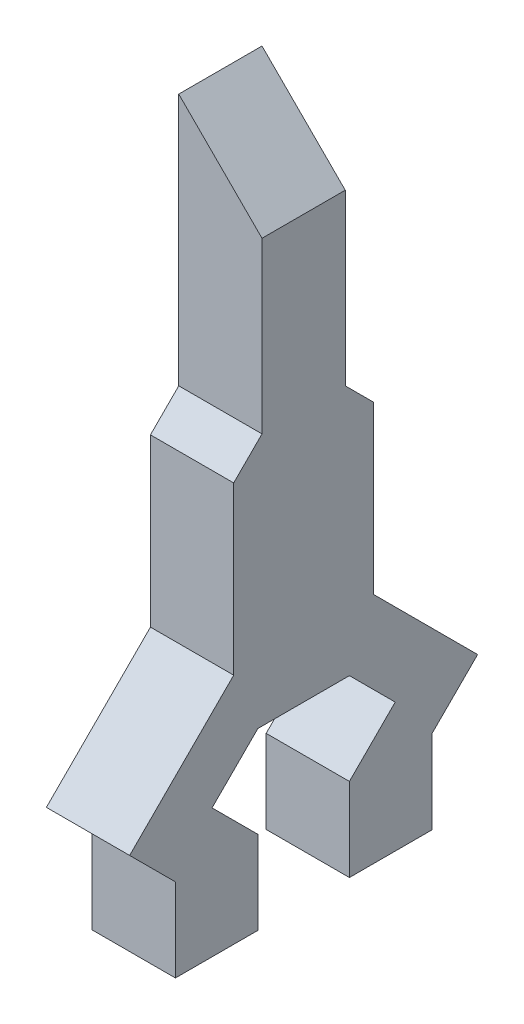
ISO-10303-21;
HEADER;
FILE_DESCRIPTION(('STEP AP214'),'2;1');
FILE_NAME('part.step','',(''),(''),'','','');
FILE_SCHEMA(('AUTOMOTIVE_DESIGN { 1 0 10303 214 1 1 1 1 }'));
ENDSEC;
DATA;
#1=APPLICATION_CONTEXT('core data for automotive mechanical design processes');
#2=APPLICATION_PROTOCOL_DEFINITION('international standard','automotive_design',2000,#1);
#3=PRODUCT_CONTEXT('',#1,'mechanical');
#4=PRODUCT('Part','Part','',(#3));
#5=PRODUCT_RELATED_PRODUCT_CATEGORY('part','',(#4));
#6=PRODUCT_DEFINITION_FORMATION('','',#4);
#7=PRODUCT_DEFINITION_CONTEXT('part definition',#1,'design');
#8=PRODUCT_DEFINITION('design','',#6,#7);
#9=PRODUCT_DEFINITION_SHAPE('','',#8);
#10=(LENGTH_UNIT() NAMED_UNIT(*) SI_UNIT(.MILLI.,.METRE.));
#11=(NAMED_UNIT(*) PLANE_ANGLE_UNIT() SI_UNIT($,.RADIAN.));
#12=(NAMED_UNIT(*) SI_UNIT($,.STERADIAN.) SOLID_ANGLE_UNIT());
#13=UNCERTAINTY_MEASURE_WITH_UNIT(LENGTH_MEASURE(1.E-05),#10,'distance_accuracy_value','');
#14=(GEOMETRIC_REPRESENTATION_CONTEXT(3) GLOBAL_UNCERTAINTY_ASSIGNED_CONTEXT((#13)) GLOBAL_UNIT_ASSIGNED_CONTEXT((#10,
#11,#12)) REPRESENTATION_CONTEXT('',''));
#15=CARTESIAN_POINT('',(0.,0.,0.));
#16=DIRECTION('',(0.,0.,1.));
#17=DIRECTION('',(1.,0.,0.));
#18=AXIS2_PLACEMENT_3D('',#15,#16,#17);
#19=CARTESIAN_POINT('',(10.,32.5,8.39949493661167));
#20=DIRECTION('',(0.,-0.707106781186539,-0.707106781186556));
#21=DIRECTION('',(0.,0.707106781186556,-0.707106781186539));
#22=AXIS2_PLACEMENT_3D('',#19,#20,#21);
#23=PLANE('',#22);
#24=DIRECTION('',(1.,0.,0.));
#25=VECTOR('',#24,1.);
#26=CARTESIAN_POINT('',(10.,35.8994949366118,5.));
#27=LINE('',#26,#25);
#28=CARTESIAN_POINT('',(0.,35.8994949366118,5.));
#29=VERTEX_POINT('',#28);
#30=CARTESIAN_POINT('',(10.,35.8994949366118,5.));
#31=VERTEX_POINT('',#30);
#32=EDGE_CURVE('E196',#29,#31,#27,.T.);
#33=ORIENTED_EDGE('',*,*,#32,.F.);
#34=DIRECTION('',(0.,-0.707106781186556,0.707106781186539));
#35=VECTOR('',#34,1.);
#36=CARTESIAN_POINT('',(0.,32.5,8.39949493661167));
#37=LINE('',#36,#35);
#38=CARTESIAN_POINT('',(0.,32.5,8.39949493661167));
#39=VERTEX_POINT('',#38);
#40=EDGE_CURVE('E315',#29,#39,#37,.T.);
#41=ORIENTED_EDGE('',*,*,#40,.T.);
#42=DIRECTION('',(-1.,0.,0.));
#43=VECTOR('',#42,1.);
#44=CARTESIAN_POINT('',(10.,32.5,8.39949493661167));
#45=LINE('',#44,#43);
#46=CARTESIAN_POINT('',(10.,32.5,8.39949493661167));
#47=VERTEX_POINT('',#46);
#48=EDGE_CURVE('E393',#47,#39,#45,.T.);
#49=ORIENTED_EDGE('',*,*,#48,.F.);
#50=DIRECTION('',(0.,-0.707106781186556,0.707106781186539));
#51=VECTOR('',#50,1.);
#52=CARTESIAN_POINT('',(10.,32.5,8.39949493661167));
#53=LINE('',#52,#51);
#54=EDGE_CURVE('E258',#31,#47,#53,.T.);
#55=ORIENTED_EDGE('',*,*,#54,.F.);
#56=EDGE_LOOP('',(#33,#41,#49,#55));
#57=FACE_BOUND('',#56,.T.);
#58=ADVANCED_FACE('F39',(#57),#23,.F.);
#59=CARTESIAN_POINT('',(10.,-5.5,-5.5));
#60=DIRECTION('',(0.,0.,-1.));
#61=DIRECTION('',(-1.,0.,0.));
#62=AXIS2_PLACEMENT_3D('',#59,#60,#61);
#63=PLANE('',#62);
#64=DIRECTION('',(0.,-1.,0.));
#65=VECTOR('',#64,1.);
#66=CARTESIAN_POINT('',(0.,-5.5,-5.5));
#67=LINE('',#66,#65);
#68=CARTESIAN_POINT('',(0.,-5.5,-5.5));
#69=VERTEX_POINT('',#68);
#70=CARTESIAN_POINT('',(0.,-15.5,-5.5));
#71=VERTEX_POINT('',#70);
#72=EDGE_CURVE('E234',#69,#71,#67,.T.);
#73=ORIENTED_EDGE('',*,*,#72,.T.);
#74=DIRECTION('',(-1.,0.,0.));
#75=VECTOR('',#74,1.);
#76=CARTESIAN_POINT('',(10.,-15.5,-5.5));
#77=LINE('',#76,#75);
#78=CARTESIAN_POINT('',(10.,-15.5,-5.5));
#79=VERTEX_POINT('',#78);
#80=EDGE_CURVE('E11',#79,#71,#77,.T.);
#81=ORIENTED_EDGE('',*,*,#80,.F.);
#82=DIRECTION('',(0.,-1.,0.));
#83=VECTOR('',#82,1.);
#84=CARTESIAN_POINT('',(10.,-5.5,-5.5));
#85=LINE('',#84,#83);
#86=CARTESIAN_POINT('',(10.,-5.5,-5.5));
#87=VERTEX_POINT('',#86);
#88=EDGE_CURVE('E235',#87,#79,#85,.T.);
#89=ORIENTED_EDGE('',*,*,#88,.F.);
#90=DIRECTION('',(-1.,0.,0.));
#91=VECTOR('',#90,1.);
#92=CARTESIAN_POINT('',(10.,-5.5,-5.5));
#93=LINE('',#92,#91);
#94=EDGE_CURVE('E294',#87,#69,#93,.T.);
#95=ORIENTED_EDGE('',*,*,#94,.T.);
#96=EDGE_LOOP('',(#73,#81,#89,#95));
#97=FACE_BOUND('',#96,.T.);
#98=ADVANCED_FACE('F41',(#97),#63,.F.);
#99=CARTESIAN_POINT('',(10.,-15.5,-15.3994949366117));
#100=DIRECTION('',(0.,1.,0.));
#101=DIRECTION('',(0.,0.,1.));
#102=AXIS2_PLACEMENT_3D('',#99,#100,#101);
#103=PLANE('',#102);
#104=DIRECTION('',(0.,0.,-1.));
#105=VECTOR('',#104,1.);
#106=CARTESIAN_POINT('',(0.,-15.5,-15.3994949366117));
#107=LINE('',#106,#105);
#108=CARTESIAN_POINT('',(0.,-15.5,-15.3994949366117));
#109=VERTEX_POINT('',#108);
#110=EDGE_CURVE('E298',#71,#109,#107,.T.);
#111=ORIENTED_EDGE('',*,*,#110,.T.);
#112=DIRECTION('',(-1.,0.,0.));
#113=VECTOR('',#112,1.);
#114=CARTESIAN_POINT('',(10.,-15.5,-15.3994949366117));
#115=LINE('',#114,#113);
#116=CARTESIAN_POINT('',(10.,-15.5,-15.3994949366117));
#117=VERTEX_POINT('',#116);
#118=EDGE_CURVE('E48',#117,#109,#115,.T.);
#119=ORIENTED_EDGE('',*,*,#118,.F.);
#120=DIRECTION('',(0.,0.,-1.));
#121=VECTOR('',#120,1.);
#122=CARTESIAN_POINT('',(10.,-15.5,-15.3994949366117));
#123=LINE('',#122,#121);
#124=EDGE_CURVE('E239',#79,#117,#123,.T.);
#125=ORIENTED_EDGE('',*,*,#124,.F.);
#126=ORIENTED_EDGE('',*,*,#80,.T.);
#127=EDGE_LOOP('',(#111,#119,#125,#126));
#128=FACE_BOUND('',#127,.T.);
#129=ADVANCED_FACE('F439',(#128),#103,.F.);
#130=CARTESIAN_POINT('',(10.,-5.5,-15.3994949366117));
#131=DIRECTION('',(0.,0.,1.));
#132=DIRECTION('',(1.,0.,0.));
#133=AXIS2_PLACEMENT_3D('',#130,#131,#132);
#134=PLANE('',#133);
#135=DIRECTION('',(0.,1.,0.));
#136=VECTOR('',#135,1.);
#137=CARTESIAN_POINT('',(0.,-5.5,-15.3994949366117));
#138=LINE('',#137,#136);
#139=CARTESIAN_POINT('',(0.,-5.5,-15.3994949366117));
#140=VERTEX_POINT('',#139);
#141=EDGE_CURVE('E301',#109,#140,#138,.T.);
#142=ORIENTED_EDGE('',*,*,#141,.T.);
#143=DIRECTION('',(-1.,0.,0.));
#144=VECTOR('',#143,1.);
#145=CARTESIAN_POINT('',(10.,-5.5,-15.3994949366117));
#146=LINE('',#145,#144);
#147=CARTESIAN_POINT('',(10.,-5.5,-15.3994949366117));
#148=VERTEX_POINT('',#147);
#149=EDGE_CURVE('E408',#148,#140,#146,.T.);
#150=ORIENTED_EDGE('',*,*,#149,.F.);
#151=DIRECTION('',(0.,1.,0.));
#152=VECTOR('',#151,1.);
#153=CARTESIAN_POINT('',(10.,-5.5,-15.3994949366117));
#154=LINE('',#153,#152);
#155=EDGE_CURVE('E243',#117,#148,#154,.T.);
#156=ORIENTED_EDGE('',*,*,#155,.F.);
#157=ORIENTED_EDGE('',*,*,#118,.T.);
#158=EDGE_LOOP('',(#142,#150,#156,#157));
#159=FACE_BOUND('',#158,.T.);
#160=ADVANCED_FACE('F417',(#159),#134,.F.);
#161=CARTESIAN_POINT('',(10.,0.,-20.8994949366117));
#162=DIRECTION('',(0.,0.707106781186547,0.707106781186548));
#163=DIRECTION('',(0.,-0.707106781186548,0.707106781186547));
#164=AXIS2_PLACEMENT_3D('',#161,#162,#163);
#165=PLANE('',#164);
#166=DIRECTION('',(0.,0.707106781186548,-0.707106781186547));
#167=VECTOR('',#166,1.);
#168=CARTESIAN_POINT('',(0.,0.,-20.8994949366117));
#169=LINE('',#168,#167);
#170=CARTESIAN_POINT('',(0.,0.,-20.8994949366117));
#171=VERTEX_POINT('',#170);
#172=EDGE_CURVE('E304',#140,#171,#169,.T.);
#173=ORIENTED_EDGE('',*,*,#172,.T.);
#174=DIRECTION('',(-1.,0.,0.));
#175=VECTOR('',#174,1.);
#176=CARTESIAN_POINT('',(10.,0.,-20.8994949366117));
#177=LINE('',#176,#175);
#178=CARTESIAN_POINT('',(10.,0.,-20.8994949366117));
#179=VERTEX_POINT('',#178);
#180=EDGE_CURVE('E404',#179,#171,#177,.T.);
#181=ORIENTED_EDGE('',*,*,#180,.F.);
#182=DIRECTION('',(0.,0.707106781186548,-0.707106781186547));
#183=VECTOR('',#182,1.);
#184=CARTESIAN_POINT('',(10.,0.,-20.8994949366117));
#185=LINE('',#184,#183);
#186=EDGE_CURVE('E246',#148,#179,#185,.T.);
#187=ORIENTED_EDGE('',*,*,#186,.F.);
#188=ORIENTED_EDGE('',*,*,#149,.T.);
#189=EDGE_LOOP('',(#173,#181,#187,#188));
#190=FACE_BOUND('',#189,.T.);
#191=ADVANCED_FACE('F429',(#190),#165,.F.);
#192=CARTESIAN_POINT('',(10.,12.5,-8.39949493661167));
#193=DIRECTION('',(0.,-0.707106781186547,0.707106781186548));
#194=DIRECTION('',(0.,-0.707106781186548,-0.707106781186547));
#195=AXIS2_PLACEMENT_3D('',#192,#193,#194);
#196=PLANE('',#195);
#197=DIRECTION('',(0.,0.707106781186548,0.707106781186547));
#198=VECTOR('',#197,1.);
#199=CARTESIAN_POINT('',(0.,12.5,-8.39949493661167));
#200=LINE('',#199,#198);
#201=CARTESIAN_POINT('',(0.,12.5,-8.39949493661167));
#202=VERTEX_POINT('',#201);
#203=EDGE_CURVE('E307',#171,#202,#200,.T.);
#204=ORIENTED_EDGE('',*,*,#203,.T.);
#205=DIRECTION('',(-1.,0.,0.));
#206=VECTOR('',#205,1.);
#207=CARTESIAN_POINT('',(10.,12.5,-8.39949493661167));
#208=LINE('',#207,#206);
#209=CARTESIAN_POINT('',(10.,12.5,-8.39949493661167));
#210=VERTEX_POINT('',#209);
#211=EDGE_CURVE('E400',#210,#202,#208,.T.);
#212=ORIENTED_EDGE('',*,*,#211,.F.);
#213=DIRECTION('',(0.,0.707106781186548,0.707106781186547));
#214=VECTOR('',#213,1.);
#215=CARTESIAN_POINT('',(10.,12.5,-8.39949493661167));
#216=LINE('',#215,#214);
#217=EDGE_CURVE('E249',#179,#210,#216,.T.);
#218=ORIENTED_EDGE('',*,*,#217,.F.);
#219=ORIENTED_EDGE('',*,*,#180,.T.);
#220=EDGE_LOOP('',(#204,#212,#218,#219));
#221=FACE_BOUND('',#220,.T.);
#222=ADVANCED_FACE('F433',(#221),#196,.F.);
#223=CARTESIAN_POINT('',(10.,32.5000000000004,-8.39949493661167));
#224=DIRECTION('',(0.,0.,1.));
#225=DIRECTION('',(1.,0.,0.));
#226=AXIS2_PLACEMENT_3D('',#223,#224,#225);
#227=PLANE('',#226);
#228=DIRECTION('',(0.,1.,0.));
#229=VECTOR('',#228,1.);
#230=CARTESIAN_POINT('',(0.,32.5000000000004,-8.39949493661167));
#231=LINE('',#230,#229);
#232=CARTESIAN_POINT('',(0.,32.5000000000004,-8.39949493661167));
#233=VERTEX_POINT('',#232);
#234=EDGE_CURVE('E310',#202,#233,#231,.T.);
#235=ORIENTED_EDGE('',*,*,#234,.T.);
#236=DIRECTION('',(-1.,0.,0.));
#237=VECTOR('',#236,1.);
#238=CARTESIAN_POINT('',(10.,32.5000000000004,-8.39949493661167));
#239=LINE('',#238,#237);
#240=CARTESIAN_POINT('',(10.,32.5000000000004,-8.39949493661167));
#241=VERTEX_POINT('',#240);
#242=EDGE_CURVE('E397',#241,#233,#239,.T.);
#243=ORIENTED_EDGE('',*,*,#242,.F.);
#244=DIRECTION('',(0.,1.,0.));
#245=VECTOR('',#244,1.);
#246=CARTESIAN_POINT('',(10.,32.5000000000004,-8.39949493661167));
#247=LINE('',#246,#245);
#248=EDGE_CURVE('E252',#210,#241,#247,.T.);
#249=ORIENTED_EDGE('',*,*,#248,.F.);
#250=ORIENTED_EDGE('',*,*,#211,.T.);
#251=EDGE_LOOP('',(#235,#243,#249,#250));
#252=FACE_BOUND('',#251,.T.);
#253=ADVANCED_FACE('F520',(#252),#227,.F.);
#254=CARTESIAN_POINT('',(10.,40.8994949366119,0.));
#255=DIRECTION('',(0.,-0.707106781186557,0.707106781186538));
#256=DIRECTION('',(0.,-0.707106781186538,-0.707106781186557));
#257=AXIS2_PLACEMENT_3D('',#254,#255,#256);
#258=PLANE('',#257);
#259=DIRECTION('',(0.,0.707106781186538,0.707106781186557));
#260=VECTOR('',#259,1.);
#261=CARTESIAN_POINT('',(0.,40.8994949366119,0.));
#262=LINE('',#261,#260);
#263=CARTESIAN_POINT('',(0.,35.899494936612,-5.));
#264=VERTEX_POINT('',#263);
#265=EDGE_CURVE('E60',#233,#264,#262,.T.);
#266=ORIENTED_EDGE('',*,*,#265,.T.);
#267=DIRECTION('',(1.,0.,0.));
#268=VECTOR('',#267,1.);
#269=CARTESIAN_POINT('',(10.,35.899494936612,-5.));
#270=LINE('',#269,#268);
#271=CARTESIAN_POINT('',(10.,35.899494936612,-5.));
#272=VERTEX_POINT('',#271);
#273=EDGE_CURVE('E55',#264,#272,#270,.T.);
#274=ORIENTED_EDGE('',*,*,#273,.T.);
#275=DIRECTION('',(0.,0.707106781186538,0.707106781186557));
#276=VECTOR('',#275,1.);
#277=CARTESIAN_POINT('',(10.,40.8994949366119,0.));
#278=LINE('',#277,#276);
#279=EDGE_CURVE('E255',#241,#272,#278,.T.);
#280=ORIENTED_EDGE('',*,*,#279,.F.);
#281=ORIENTED_EDGE('',*,*,#242,.T.);
#282=EDGE_LOOP('',(#266,#274,#280,#281));
#283=FACE_BOUND('',#282,.T.);
#284=ADVANCED_FACE('F517',(#283),#258,.F.);
#285=CARTESIAN_POINT('',(10.,12.5,8.39949493661167));
#286=DIRECTION('',(0.,0.,-1.));
#287=DIRECTION('',(-1.,0.,0.));
#288=AXIS2_PLACEMENT_3D('',#285,#286,#287);
#289=PLANE('',#288);
#290=DIRECTION('',(0.,-1.,0.));
#291=VECTOR('',#290,1.);
#292=CARTESIAN_POINT('',(0.,12.5,8.39949493661167));
#293=LINE('',#292,#291);
#294=CARTESIAN_POINT('',(0.,12.5,8.39949493661167));
#295=VERTEX_POINT('',#294);
#296=EDGE_CURVE('E318',#39,#295,#293,.T.);
#297=ORIENTED_EDGE('',*,*,#296,.T.);
#298=DIRECTION('',(-1.,0.,0.));
#299=VECTOR('',#298,1.);
#300=CARTESIAN_POINT('',(10.,12.5,8.39949493661167));
#301=LINE('',#300,#299);
#302=CARTESIAN_POINT('',(10.,12.5,8.39949493661167));
#303=VERTEX_POINT('',#302);
#304=EDGE_CURVE('E389',#303,#295,#301,.T.);
#305=ORIENTED_EDGE('',*,*,#304,.F.);
#306=DIRECTION('',(0.,-1.,0.));
#307=VECTOR('',#306,1.);
#308=CARTESIAN_POINT('',(10.,12.5,8.39949493661167));
#309=LINE('',#308,#307);
#310=EDGE_CURVE('E261',#47,#303,#309,.T.);
#311=ORIENTED_EDGE('',*,*,#310,.F.);
#312=ORIENTED_EDGE('',*,*,#48,.T.);
#313=EDGE_LOOP('',(#297,#305,#311,#312));
#314=FACE_BOUND('',#313,.T.);
#315=ADVANCED_FACE('F495',(#314),#289,.F.);
#316=CARTESIAN_POINT('',(10.,12.5,8.39949493661167));
#317=DIRECTION('',(0.,-0.707106781186548,-0.707106781186548));
#318=DIRECTION('',(0.,0.707106781186548,-0.707106781186548));
#319=AXIS2_PLACEMENT_3D('',#316,#317,#318);
#320=PLANE('',#319);
#321=DIRECTION('',(0.,-0.707106781186547,0.707106781186547));
#322=VECTOR('',#321,1.);
#323=CARTESIAN_POINT('',(0.,12.5,8.39949493661167));
#324=LINE('',#323,#322);
#325=CARTESIAN_POINT('',(0.,0.,20.8994949366117));
#326=VERTEX_POINT('',#325);
#327=EDGE_CURVE('E321',#295,#326,#324,.T.);
#328=ORIENTED_EDGE('',*,*,#327,.T.);
#329=DIRECTION('',(-1.,0.,0.));
#330=VECTOR('',#329,1.);
#331=CARTESIAN_POINT('',(10.,0.,20.8994949366117));
#332=LINE('',#331,#330);
#333=CARTESIAN_POINT('',(10.,0.,20.8994949366117));
#334=VERTEX_POINT('',#333);
#335=EDGE_CURVE('E385',#334,#326,#332,.T.);
#336=ORIENTED_EDGE('',*,*,#335,.F.);
#337=DIRECTION('',(0.,-0.707106781186547,0.707106781186547));
#338=VECTOR('',#337,1.);
#339=CARTESIAN_POINT('',(10.,12.5,8.39949493661167));
#340=LINE('',#339,#338);
#341=EDGE_CURVE('E264',#303,#334,#340,.T.);
#342=ORIENTED_EDGE('',*,*,#341,.F.);
#343=ORIENTED_EDGE('',*,*,#304,.T.);
#344=EDGE_LOOP('',(#328,#336,#342,#343));
#345=FACE_BOUND('',#344,.T.);
#346=ADVANCED_FACE('F490',(#345),#320,.F.);
#347=CARTESIAN_POINT('',(10.,0.,20.8994949366117));
#348=DIRECTION('',(0.,0.707106781186547,-0.707106781186548));
#349=DIRECTION('',(0.,0.707106781186548,0.707106781186547));
#350=AXIS2_PLACEMENT_3D('',#347,#348,#349);
#351=PLANE('',#350);
#352=DIRECTION('',(0.,-0.707106781186548,-0.707106781186547));
#353=VECTOR('',#352,1.);
#354=CARTESIAN_POINT('',(0.,0.,20.8994949366117));
#355=LINE('',#354,#353);
#356=CARTESIAN_POINT('',(0.,-5.5,15.3994949366117));
#357=VERTEX_POINT('',#356);
#358=EDGE_CURVE('E324',#326,#357,#355,.T.);
#359=ORIENTED_EDGE('',*,*,#358,.T.);
#360=DIRECTION('',(-1.,0.,0.));
#361=VECTOR('',#360,1.);
#362=CARTESIAN_POINT('',(10.,-5.5,15.3994949366117));
#363=LINE('',#362,#361);
#364=CARTESIAN_POINT('',(10.,-5.5,15.3994949366117));
#365=VERTEX_POINT('',#364);
#366=EDGE_CURVE('E381',#365,#357,#363,.T.);
#367=ORIENTED_EDGE('',*,*,#366,.F.);
#368=DIRECTION('',(0.,-0.707106781186548,-0.707106781186547));
#369=VECTOR('',#368,1.);
#370=CARTESIAN_POINT('',(10.,0.,20.8994949366117));
#371=LINE('',#370,#369);
#372=EDGE_CURVE('E267',#334,#365,#371,.T.);
#373=ORIENTED_EDGE('',*,*,#372,.F.);
#374=ORIENTED_EDGE('',*,*,#335,.T.);
#375=EDGE_LOOP('',(#359,#367,#373,#374));
#376=FACE_BOUND('',#375,.T.);
#377=ADVANCED_FACE('F485',(#376),#351,.F.);
#378=CARTESIAN_POINT('',(10.,-15.5,15.3994949366117));
#379=DIRECTION('',(0.,0.,-1.));
#380=DIRECTION('',(-1.,0.,0.));
#381=AXIS2_PLACEMENT_3D('',#378,#379,#380);
#382=PLANE('',#381);
#383=DIRECTION('',(0.,-1.,0.));
#384=VECTOR('',#383,1.);
#385=CARTESIAN_POINT('',(0.,-15.5,15.3994949366117));
#386=LINE('',#385,#384);
#387=CARTESIAN_POINT('',(0.,-15.5,15.3994949366117));
#388=VERTEX_POINT('',#387);
#389=EDGE_CURVE('E327',#357,#388,#386,.T.);
#390=ORIENTED_EDGE('',*,*,#389,.T.);
#391=DIRECTION('',(-1.,0.,0.));
#392=VECTOR('',#391,1.);
#393=CARTESIAN_POINT('',(10.,-15.5,15.3994949366117));
#394=LINE('',#393,#392);
#395=CARTESIAN_POINT('',(10.,-15.5,15.3994949366117));
#396=VERTEX_POINT('',#395);
#397=EDGE_CURVE('E377',#396,#388,#394,.T.);
#398=ORIENTED_EDGE('',*,*,#397,.F.);
#399=DIRECTION('',(0.,-1.,0.));
#400=VECTOR('',#399,1.);
#401=CARTESIAN_POINT('',(10.,-15.5,15.3994949366117));
#402=LINE('',#401,#400);
#403=EDGE_CURVE('E270',#365,#396,#402,.T.);
#404=ORIENTED_EDGE('',*,*,#403,.F.);
#405=ORIENTED_EDGE('',*,*,#366,.T.);
#406=EDGE_LOOP('',(#390,#398,#404,#405));
#407=FACE_BOUND('',#406,.T.);
#408=ADVANCED_FACE('F481',(#407),#382,.F.);
#409=CARTESIAN_POINT('',(10.,-15.5,5.5));
#410=DIRECTION('',(0.,1.,0.));
#411=DIRECTION('',(0.,0.,1.));
#412=AXIS2_PLACEMENT_3D('',#409,#410,#411);
#413=PLANE('',#412);
#414=DIRECTION('',(0.,0.,-1.));
#415=VECTOR('',#414,1.);
#416=CARTESIAN_POINT('',(0.,-15.5,5.5));
#417=LINE('',#416,#415);
#418=CARTESIAN_POINT('',(0.,-15.5,5.5));
#419=VERTEX_POINT('',#418);
#420=EDGE_CURVE('E330',#388,#419,#417,.T.);
#421=ORIENTED_EDGE('',*,*,#420,.T.);
#422=DIRECTION('',(-1.,0.,0.));
#423=VECTOR('',#422,1.);
#424=CARTESIAN_POINT('',(10.,-15.5,5.5));
#425=LINE('',#424,#423);
#426=CARTESIAN_POINT('',(10.,-15.5,5.5));
#427=VERTEX_POINT('',#426);
#428=EDGE_CURVE('E373',#427,#419,#425,.T.);
#429=ORIENTED_EDGE('',*,*,#428,.F.);
#430=DIRECTION('',(0.,0.,-1.));
#431=VECTOR('',#430,1.);
#432=CARTESIAN_POINT('',(10.,-15.5,5.5));
#433=LINE('',#432,#431);
#434=EDGE_CURVE('E273',#396,#427,#433,.T.);
#435=ORIENTED_EDGE('',*,*,#434,.F.);
#436=ORIENTED_EDGE('',*,*,#397,.T.);
#437=EDGE_LOOP('',(#421,#429,#435,#436));
#438=FACE_BOUND('',#437,.T.);
#439=ADVANCED_FACE('F476',(#438),#413,.F.);
#440=CARTESIAN_POINT('',(10.,-5.5,5.5));
#441=DIRECTION('',(0.,0.,1.));
#442=DIRECTION('',(1.,0.,0.));
#443=AXIS2_PLACEMENT_3D('',#440,#441,#442);
#444=PLANE('',#443);
#445=DIRECTION('',(0.,1.,0.));
#446=VECTOR('',#445,1.);
#447=CARTESIAN_POINT('',(0.,-5.5,5.5));
#448=LINE('',#447,#446);
#449=CARTESIAN_POINT('',(0.,-5.5,5.5));
#450=VERTEX_POINT('',#449);
#451=EDGE_CURVE('E333',#419,#450,#448,.T.);
#452=ORIENTED_EDGE('',*,*,#451,.T.);
#453=DIRECTION('',(-1.,0.,0.));
#454=VECTOR('',#453,1.);
#455=CARTESIAN_POINT('',(10.,-5.5,5.5));
#456=LINE('',#455,#454);
#457=CARTESIAN_POINT('',(10.,-5.5,5.5));
#458=VERTEX_POINT('',#457);
#459=EDGE_CURVE('E369',#458,#450,#456,.T.);
#460=ORIENTED_EDGE('',*,*,#459,.F.);
#461=DIRECTION('',(0.,1.,0.));
#462=VECTOR('',#461,1.);
#463=CARTESIAN_POINT('',(10.,-5.5,5.5));
#464=LINE('',#463,#462);
#465=EDGE_CURVE('E276',#427,#458,#464,.T.);
#466=ORIENTED_EDGE('',*,*,#465,.F.);
#467=ORIENTED_EDGE('',*,*,#428,.T.);
#468=EDGE_LOOP('',(#452,#460,#466,#467));
#469=FACE_BOUND('',#468,.T.);
#470=ADVANCED_FACE('F470',(#469),#444,.F.);
#471=CARTESIAN_POINT('',(10.,0.,11.));
#472=DIRECTION('',(0.,-0.707106781186548,0.707106781186547));
#473=DIRECTION('',(0.,-0.707106781186547,-0.707106781186548));
#474=AXIS2_PLACEMENT_3D('',#471,#472,#473);
#475=PLANE('',#474);
#476=DIRECTION('',(0.,0.707106781186547,0.707106781186548));
#477=VECTOR('',#476,1.);
#478=CARTESIAN_POINT('',(0.,0.,11.));
#479=LINE('',#478,#477);
#480=CARTESIAN_POINT('',(0.,0.,11.));
#481=VERTEX_POINT('',#480);
#482=EDGE_CURVE('E336',#450,#481,#479,.T.);
#483=ORIENTED_EDGE('',*,*,#482,.T.);
#484=DIRECTION('',(-1.,0.,0.));
#485=VECTOR('',#484,1.);
#486=CARTESIAN_POINT('',(10.,0.,11.));
#487=LINE('',#486,#485);
#488=CARTESIAN_POINT('',(10.,0.,11.));
#489=VERTEX_POINT('',#488);
#490=EDGE_CURVE('E365',#489,#481,#487,.T.);
#491=ORIENTED_EDGE('',*,*,#490,.F.);
#492=DIRECTION('',(0.,0.707106781186547,0.707106781186548));
#493=VECTOR('',#492,1.);
#494=CARTESIAN_POINT('',(10.,0.,11.));
#495=LINE('',#494,#493);
#496=EDGE_CURVE('E279',#458,#489,#495,.T.);
#497=ORIENTED_EDGE('',*,*,#496,.F.);
#498=ORIENTED_EDGE('',*,*,#459,.T.);
#499=EDGE_LOOP('',(#483,#491,#497,#498));
#500=FACE_BOUND('',#499,.T.);
#501=ADVANCED_FACE('F466',(#500),#475,.F.);
#502=CARTESIAN_POINT('',(10.,5.5,5.5));
#503=DIRECTION('',(0.,0.707106781186548,0.707106781186548));
#504=DIRECTION('',(0.,-0.707106781186548,0.707106781186548));
#505=AXIS2_PLACEMENT_3D('',#502,#503,#504);
#506=PLANE('',#505);
#507=DIRECTION('',(0.,0.707106781186548,-0.707106781186548));
#508=VECTOR('',#507,1.);
#509=CARTESIAN_POINT('',(0.,5.5,5.5));
#510=LINE('',#509,#508);
#511=CARTESIAN_POINT('',(0.,5.5,5.5));
#512=VERTEX_POINT('',#511);
#513=EDGE_CURVE('E339',#481,#512,#510,.T.);
#514=ORIENTED_EDGE('',*,*,#513,.T.);
#515=DIRECTION('',(-1.,0.,0.));
#516=VECTOR('',#515,1.);
#517=CARTESIAN_POINT('',(10.,5.5,5.5));
#518=LINE('',#517,#516);
#519=CARTESIAN_POINT('',(10.,5.5,5.5));
#520=VERTEX_POINT('',#519);
#521=EDGE_CURVE('E361',#520,#512,#518,.T.);
#522=ORIENTED_EDGE('',*,*,#521,.F.);
#523=DIRECTION('',(0.,0.707106781186548,-0.707106781186548));
#524=VECTOR('',#523,1.);
#525=CARTESIAN_POINT('',(10.,5.5,5.5));
#526=LINE('',#525,#524);
#527=EDGE_CURVE('E282',#489,#520,#526,.T.);
#528=ORIENTED_EDGE('',*,*,#527,.F.);
#529=ORIENTED_EDGE('',*,*,#490,.T.);
#530=EDGE_LOOP('',(#514,#522,#528,#529));
#531=FACE_BOUND('',#530,.T.);
#532=ADVANCED_FACE('F461',(#531),#506,.F.);
#533=CARTESIAN_POINT('',(10.,5.5,5.5));
#534=DIRECTION('',(0.,1.,0.));
#535=DIRECTION('',(0.,0.,1.));
#536=AXIS2_PLACEMENT_3D('',#533,#534,#535);
#537=PLANE('',#536);
#538=DIRECTION('',(0.,0.,-1.));
#539=VECTOR('',#538,1.);
#540=CARTESIAN_POINT('',(0.,5.5,5.5));
#541=LINE('',#540,#539);
#542=CARTESIAN_POINT('',(0.,5.5,-5.5));
#543=VERTEX_POINT('',#542);
#544=EDGE_CURVE('E342',#512,#543,#541,.T.);
#545=ORIENTED_EDGE('',*,*,#544,.T.);
#546=DIRECTION('',(-1.,0.,0.));
#547=VECTOR('',#546,1.);
#548=CARTESIAN_POINT('',(10.,5.5,-5.5));
#549=LINE('',#548,#547);
#550=CARTESIAN_POINT('',(10.,5.5,-5.5));
#551=VERTEX_POINT('',#550);
#552=EDGE_CURVE('E357',#551,#543,#549,.T.);
#553=ORIENTED_EDGE('',*,*,#552,.F.);
#554=DIRECTION('',(0.,0.,-1.));
#555=VECTOR('',#554,1.);
#556=CARTESIAN_POINT('',(10.,5.5,5.5));
#557=LINE('',#556,#555);
#558=EDGE_CURVE('E285',#520,#551,#557,.T.);
#559=ORIENTED_EDGE('',*,*,#558,.F.);
#560=ORIENTED_EDGE('',*,*,#521,.T.);
#561=EDGE_LOOP('',(#545,#553,#559,#560));
#562=FACE_BOUND('',#561,.T.);
#563=ADVANCED_FACE('F455',(#562),#537,.F.);
#564=CARTESIAN_POINT('',(10.,5.5,-5.5));
#565=DIRECTION('',(0.,0.707106781186548,-0.707106781186547));
#566=DIRECTION('',(0.,0.707106781186547,0.707106781186548));
#567=AXIS2_PLACEMENT_3D('',#564,#565,#566);
#568=PLANE('',#567);
#569=DIRECTION('',(0.,-0.707106781186547,-0.707106781186548));
#570=VECTOR('',#569,1.);
#571=CARTESIAN_POINT('',(0.,5.5,-5.5));
#572=LINE('',#571,#570);
#573=CARTESIAN_POINT('',(0.,0.,-11.));
#574=VERTEX_POINT('',#573);
#575=EDGE_CURVE('E345',#543,#574,#572,.T.);
#576=ORIENTED_EDGE('',*,*,#575,.T.);
#577=DIRECTION('',(-1.,0.,0.));
#578=VECTOR('',#577,1.);
#579=CARTESIAN_POINT('',(10.,0.,-11.));
#580=LINE('',#579,#578);
#581=CARTESIAN_POINT('',(10.,0.,-11.));
#582=VERTEX_POINT('',#581);
#583=EDGE_CURVE('E353',#582,#574,#580,.T.);
#584=ORIENTED_EDGE('',*,*,#583,.F.);
#585=DIRECTION('',(0.,-0.707106781186547,-0.707106781186548));
#586=VECTOR('',#585,1.);
#587=CARTESIAN_POINT('',(10.,5.5,-5.5));
#588=LINE('',#587,#586);
#589=EDGE_CURVE('E288',#551,#582,#588,.T.);
#590=ORIENTED_EDGE('',*,*,#589,.F.);
#591=ORIENTED_EDGE('',*,*,#552,.T.);
#592=EDGE_LOOP('',(#576,#584,#590,#591));
#593=FACE_BOUND('',#592,.T.);
#594=ADVANCED_FACE('F451',(#593),#568,.F.);
#595=CARTESIAN_POINT('',(10.,0.,-11.));
#596=DIRECTION('',(0.,-0.707106781186547,-0.707106781186548));
#597=DIRECTION('',(0.,0.707106781186548,-0.707106781186547));
#598=AXIS2_PLACEMENT_3D('',#595,#596,#597);
#599=PLANE('',#598);
#600=DIRECTION('',(0.,-0.707106781186548,0.707106781186547));
#601=VECTOR('',#600,1.);
#602=CARTESIAN_POINT('',(0.,0.,-11.));
#603=LINE('',#602,#601);
#604=EDGE_CURVE('E240',#574,#69,#603,.T.);
#605=ORIENTED_EDGE('',*,*,#604,.T.);
#606=ORIENTED_EDGE('',*,*,#94,.F.);
#607=DIRECTION('',(0.,-0.707106781186548,0.707106781186547));
#608=VECTOR('',#607,1.);
#609=CARTESIAN_POINT('',(10.,0.,-11.));
#610=LINE('',#609,#608);
#611=EDGE_CURVE('E291',#582,#87,#610,.T.);
#612=ORIENTED_EDGE('',*,*,#611,.F.);
#613=ORIENTED_EDGE('',*,*,#583,.T.);
#614=EDGE_LOOP('',(#605,#606,#612,#613));
#615=FACE_BOUND('',#614,.T.);
#616=ADVANCED_FACE('F446',(#615),#599,.F.);
#617=CARTESIAN_POINT('',(10.,0.,0.));
#618=DIRECTION('',(-1.,0.,0.));
#619=DIRECTION('',(0.,0.,1.));
#620=AXIS2_PLACEMENT_3D('',#617,#618,#619);
#621=PLANE('',#620);
#622=ORIENTED_EDGE('',*,*,#279,.T.);
#623=DIRECTION('',(0.,1.,0.));
#624=VECTOR('',#623,1.);
#625=CARTESIAN_POINT('',(9.99999999999999,56.2499999999999,-5.));
#626=LINE('',#625,#624);
#627=CARTESIAN_POINT('',(9.99999999999999,56.2499999999999,-5.));
#628=VERTEX_POINT('',#627);
#629=EDGE_CURVE('E205',#272,#628,#626,.T.);
#630=ORIENTED_EDGE('',*,*,#629,.T.);
#631=DIRECTION('',(0.,0.,-1.));
#632=VECTOR('',#631,1.);
#633=CARTESIAN_POINT('',(9.99999999999999,56.2499999999999,5.));
#634=LINE('',#633,#632);
#635=CARTESIAN_POINT('',(9.99999999999999,56.2499999999999,5.));
#636=VERTEX_POINT('',#635);
#637=EDGE_CURVE('E202',#636,#628,#634,.T.);
#638=ORIENTED_EDGE('',*,*,#637,.F.);
#639=DIRECTION('',(0.,1.,0.));
#640=VECTOR('',#639,1.);
#641=CARTESIAN_POINT('',(9.99999999999999,56.2499999999999,5.));
#642=LINE('',#641,#640);
#643=EDGE_CURVE('E189',#31,#636,#642,.T.);
#644=ORIENTED_EDGE('',*,*,#643,.F.);
#645=ORIENTED_EDGE('',*,*,#54,.T.);
#646=ORIENTED_EDGE('',*,*,#310,.T.);
#647=ORIENTED_EDGE('',*,*,#341,.T.);
#648=ORIENTED_EDGE('',*,*,#372,.T.);
#649=ORIENTED_EDGE('',*,*,#403,.T.);
#650=ORIENTED_EDGE('',*,*,#434,.T.);
#651=ORIENTED_EDGE('',*,*,#465,.T.);
#652=ORIENTED_EDGE('',*,*,#496,.T.);
#653=ORIENTED_EDGE('',*,*,#527,.T.);
#654=ORIENTED_EDGE('',*,*,#558,.T.);
#655=ORIENTED_EDGE('',*,*,#589,.T.);
#656=ORIENTED_EDGE('',*,*,#611,.T.);
#657=ORIENTED_EDGE('',*,*,#88,.T.);
#658=ORIENTED_EDGE('',*,*,#124,.T.);
#659=ORIENTED_EDGE('',*,*,#155,.T.);
#660=ORIENTED_EDGE('',*,*,#186,.T.);
#661=ORIENTED_EDGE('',*,*,#217,.T.);
#662=ORIENTED_EDGE('',*,*,#248,.T.);
#663=EDGE_LOOP('',(#622,#630,#638,#644,#645,#646,#647,#648,#649,#650,#651,#652,#653,#654,#655,
#656,#657,#658,#659,#660,#661,#662));
#664=FACE_BOUND('',#663,.T.);
#665=ADVANCED_FACE('F203',(#664),#621,.F.);
#666=CARTESIAN_POINT('',(0.,0.,0.));
#667=DIRECTION('',(-1.,0.,0.));
#668=DIRECTION('',(0.,0.,1.));
#669=AXIS2_PLACEMENT_3D('',#666,#667,#668);
#670=PLANE('',#669);
#671=ORIENTED_EDGE('',*,*,#40,.F.);
#672=DIRECTION('',(0.,-1.,0.));
#673=VECTOR('',#672,1.);
#674=CARTESIAN_POINT('',(0.,6.25,5.));
#675=LINE('',#674,#673);
#676=CARTESIAN_POINT('',(0.,66.25,5.));
#677=VERTEX_POINT('',#676);
#678=EDGE_CURVE('E215',#677,#29,#675,.T.);
#679=ORIENTED_EDGE('',*,*,#678,.F.);
#680=DIRECTION('',(0.,0.,-1.));
#681=VECTOR('',#680,1.);
#682=CARTESIAN_POINT('',(0.,66.25,5.));
#683=LINE('',#682,#681);
#684=CARTESIAN_POINT('',(0.,66.25,-5.));
#685=VERTEX_POINT('',#684);
#686=EDGE_CURVE('E209',#677,#685,#683,.T.);
#687=ORIENTED_EDGE('',*,*,#686,.T.);
#688=DIRECTION('',(0.,-1.,0.));
#689=VECTOR('',#688,1.);
#690=CARTESIAN_POINT('',(0.,6.25,-5.));
#691=LINE('',#690,#689);
#692=EDGE_CURVE('E199',#685,#264,#691,.T.);
#693=ORIENTED_EDGE('',*,*,#692,.T.);
#694=ORIENTED_EDGE('',*,*,#265,.F.);
#695=ORIENTED_EDGE('',*,*,#234,.F.);
#696=ORIENTED_EDGE('',*,*,#203,.F.);
#697=ORIENTED_EDGE('',*,*,#172,.F.);
#698=ORIENTED_EDGE('',*,*,#141,.F.);
#699=ORIENTED_EDGE('',*,*,#110,.F.);
#700=ORIENTED_EDGE('',*,*,#72,.F.);
#701=ORIENTED_EDGE('',*,*,#604,.F.);
#702=ORIENTED_EDGE('',*,*,#575,.F.);
#703=ORIENTED_EDGE('',*,*,#544,.F.);
#704=ORIENTED_EDGE('',*,*,#513,.F.);
#705=ORIENTED_EDGE('',*,*,#482,.F.);
#706=ORIENTED_EDGE('',*,*,#451,.F.);
#707=ORIENTED_EDGE('',*,*,#420,.F.);
#708=ORIENTED_EDGE('',*,*,#389,.F.);
#709=ORIENTED_EDGE('',*,*,#358,.F.);
#710=ORIENTED_EDGE('',*,*,#327,.F.);
#711=ORIENTED_EDGE('',*,*,#296,.F.);
#712=EDGE_LOOP('',(#671,#679,#687,#693,#694,#695,#696,#697,#698,#699,#700,#701,#702,#703,#704,
#705,#706,#707,#708,#709,#710,#711));
#713=FACE_BOUND('',#712,.T.);
#714=ADVANCED_FACE('F423',(#713),#670,.T.);
#715=CARTESIAN_POINT('',(0.,0.,5.));
#716=DIRECTION('',(0.,0.,-1.));
#717=DIRECTION('',(-1.,0.,0.));
#718=AXIS2_PLACEMENT_3D('',#715,#716,#717);
#719=PLANE('',#718);
#720=ORIENTED_EDGE('',*,*,#678,.T.);
#721=ORIENTED_EDGE('',*,*,#32,.T.);
#722=ORIENTED_EDGE('',*,*,#643,.T.);
#723=DIRECTION('',(-0.707106781186544,0.707106781186551,0.));
#724=VECTOR('',#723,1.);
#725=CARTESIAN_POINT('',(0.,66.25,5.));
#726=LINE('',#725,#724);
#727=EDGE_CURVE('E194',#636,#677,#726,.T.);
#728=ORIENTED_EDGE('',*,*,#727,.T.);
#729=EDGE_LOOP('',(#720,#721,#722,#728));
#730=FACE_BOUND('',#729,.T.);
#731=ADVANCED_FACE('F192',(#730),#719,.F.);
#732=CARTESIAN_POINT('',(0.,0.,-5.));
#733=DIRECTION('',(0.,0.,-1.));
#734=DIRECTION('',(-1.,0.,0.));
#735=AXIS2_PLACEMENT_3D('',#732,#733,#734);
#736=PLANE('',#735);
#737=ORIENTED_EDGE('',*,*,#273,.F.);
#738=ORIENTED_EDGE('',*,*,#692,.F.);
#739=DIRECTION('',(-0.707106781186544,0.707106781186551,0.));
#740=VECTOR('',#739,1.);
#741=CARTESIAN_POINT('',(0.,66.25,-5.));
#742=LINE('',#741,#740);
#743=EDGE_CURVE('E222',#628,#685,#742,.T.);
#744=ORIENTED_EDGE('',*,*,#743,.F.);
#745=ORIENTED_EDGE('',*,*,#629,.F.);
#746=EDGE_LOOP('',(#737,#738,#744,#745));
#747=FACE_BOUND('',#746,.T.);
#748=ADVANCED_FACE('F500',(#747),#736,.T.);
#749=CARTESIAN_POINT('',(0.,66.25,5.));
#750=DIRECTION('',(-0.707106781186551,-0.707106781186544,0.));
#751=DIRECTION('',(0.707106781186544,-0.707106781186551,0.));
#752=AXIS2_PLACEMENT_3D('',#749,#750,#751);
#753=PLANE('',#752);
#754=ORIENTED_EDGE('',*,*,#743,.T.);
#755=ORIENTED_EDGE('',*,*,#686,.F.);
#756=ORIENTED_EDGE('',*,*,#727,.F.);
#757=ORIENTED_EDGE('',*,*,#637,.T.);
#758=EDGE_LOOP('',(#754,#755,#756,#757));
#759=FACE_BOUND('',#758,.T.);
#760=ADVANCED_FACE('F211',(#759),#753,.F.);
#761=CLOSED_SHELL('',(#58,#98,#129,#160,#191,#222,#253,#284,#315,#346,#377,#408,#439,#470,#501,
#532,#563,#594,#616,#665,#714,#731,#748,#760));
#762=MANIFOLD_SOLID_BREP('B2',#761);
#763=ADVANCED_BREP_SHAPE_REPRESENTATION('',(#18,#762),#14);
#764=SHAPE_DEFINITION_REPRESENTATION(#9,#763);
ENDSEC;
END-ISO-10303-21;
